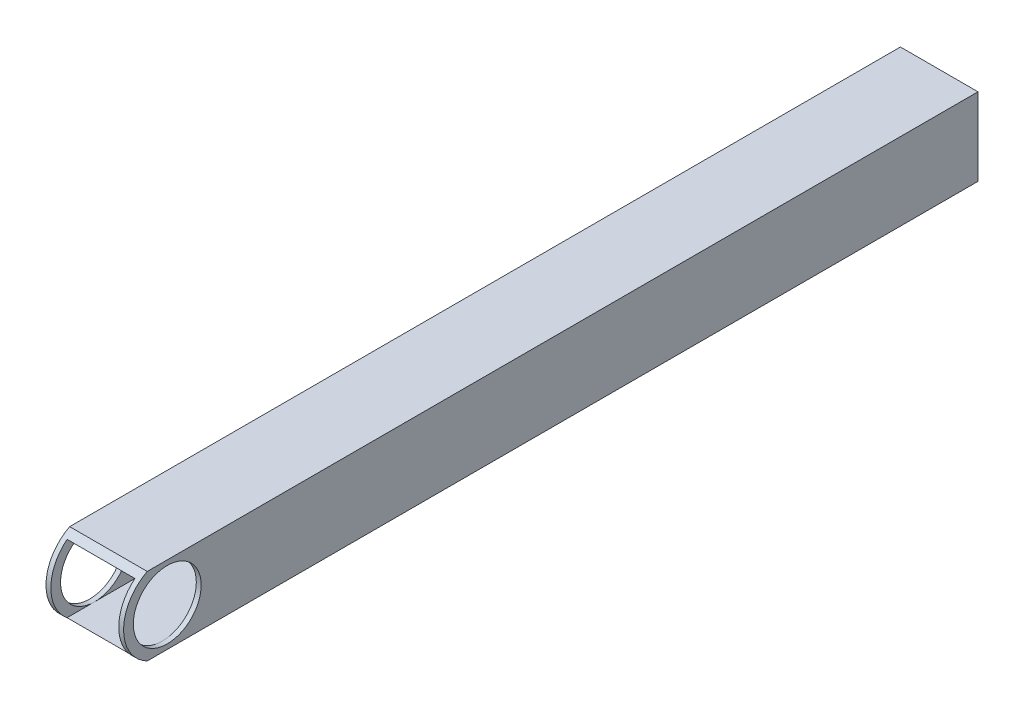
ISO-10303-21;
HEADER;
FILE_DESCRIPTION(('STEP AP214'),'2;1');
FILE_NAME('part.step','',(''),(''),'','','');
FILE_SCHEMA(('AUTOMOTIVE_DESIGN { 1 0 10303 214 1 1 1 1 }'));
ENDSEC;
DATA;
#1=APPLICATION_CONTEXT('core data for automotive mechanical design processes');
#2=APPLICATION_PROTOCOL_DEFINITION('international standard','automotive_design',2000,#1);
#3=PRODUCT_CONTEXT('',#1,'mechanical');
#4=PRODUCT('Part','Part','',(#3));
#5=PRODUCT_RELATED_PRODUCT_CATEGORY('part','',(#4));
#6=PRODUCT_DEFINITION_FORMATION('','',#4);
#7=PRODUCT_DEFINITION_CONTEXT('part definition',#1,'design');
#8=PRODUCT_DEFINITION('design','',#6,#7);
#9=PRODUCT_DEFINITION_SHAPE('','',#8);
#10=(LENGTH_UNIT() NAMED_UNIT(*) SI_UNIT(.MILLI.,.METRE.));
#11=(NAMED_UNIT(*) PLANE_ANGLE_UNIT() SI_UNIT($,.RADIAN.));
#12=(NAMED_UNIT(*) SI_UNIT($,.STERADIAN.) SOLID_ANGLE_UNIT());
#13=UNCERTAINTY_MEASURE_WITH_UNIT(LENGTH_MEASURE(1.E-05),#10,'distance_accuracy_value','');
#14=(GEOMETRIC_REPRESENTATION_CONTEXT(3) GLOBAL_UNCERTAINTY_ASSIGNED_CONTEXT((#13)) GLOBAL_UNIT_ASSIGNED_CONTEXT((#10,
#11,#12)) REPRESENTATION_CONTEXT('',''));
#15=CARTESIAN_POINT('',(0.,0.,0.));
#16=DIRECTION('',(0.,0.,1.));
#17=DIRECTION('',(1.,0.,0.));
#18=AXIS2_PLACEMENT_3D('',#15,#16,#17);
#19=CARTESIAN_POINT('',(-11.1125,-12.7,142.24));
#20=DIRECTION('',(1.,0.,0.));
#21=DIRECTION('',(0.,0.,-1.));
#22=AXIS2_PLACEMENT_3D('',#19,#20,#21);
#23=PLANE('',#22);
#24=CARTESIAN_POINT('',(-11.1125,0.,123.19));
#25=DIRECTION('',(1.,0.,0.));
#26=DIRECTION('',(0.,0.,-1.));
#27=AXIS2_PLACEMENT_3D('',#24,#25,#26);
#28=CIRCLE('',#27,14.2875);
#29=CARTESIAN_POINT('',(-11.1125,-11.1125,132.170256121069));
#30=VERTEX_POINT('',#29);
#31=CARTESIAN_POINT('',(-11.1125,11.1125,132.170256121069));
#32=VERTEX_POINT('',#31);
#33=EDGE_CURVE('E83',#30,#32,#28,.F.);
#34=ORIENTED_EDGE('',*,*,#33,.F.);
#35=DIRECTION('',(0.,0.,-1.));
#36=VECTOR('',#35,1.);
#37=CARTESIAN_POINT('',(-11.1125,-11.1125,142.24));
#38=LINE('',#37,#36);
#39=CARTESIAN_POINT('',(-11.1125,-11.1125,123.19));
#40=VERTEX_POINT('',#39);
#41=EDGE_CURVE('E170',#30,#40,#38,.T.);
#42=ORIENTED_EDGE('',*,*,#41,.T.);
#43=CARTESIAN_POINT('',(-11.1125,0.,123.19));
#44=DIRECTION('',(1.,0.,0.));
#45=DIRECTION('',(0.,0.,-1.));
#46=AXIS2_PLACEMENT_3D('',#43,#44,#45);
#47=CIRCLE('',#46,11.1125);
#48=CARTESIAN_POINT('',(-11.1125,11.1125,123.19));
#49=VERTEX_POINT('',#48);
#50=EDGE_CURVE('E194',#49,#40,#47,.T.);
#51=ORIENTED_EDGE('',*,*,#50,.F.);
#52=DIRECTION('',(0.,0.,-1.));
#53=VECTOR('',#52,1.);
#54=CARTESIAN_POINT('',(-11.1125,11.1125,142.24));
#55=LINE('',#54,#53);
#56=EDGE_CURVE('E179',#32,#49,#55,.T.);
#57=ORIENTED_EDGE('',*,*,#56,.F.);
#58=EDGE_LOOP('',(#34,#42,#51,#57));
#59=FACE_BOUND('',#58,.T.);
#60=ADVANCED_FACE('F61',(#59),#23,.T.);
#61=CARTESIAN_POINT('',(11.1125,-12.7,142.24));
#62=DIRECTION('',(-1.,0.,0.));
#63=DIRECTION('',(0.,0.,1.));
#64=AXIS2_PLACEMENT_3D('',#61,#62,#63);
#65=PLANE('',#64);
#66=CARTESIAN_POINT('',(11.1125,0.,123.19));
#67=DIRECTION('',(-1.,0.,0.));
#68=DIRECTION('',(0.,0.,1.));
#69=AXIS2_PLACEMENT_3D('',#66,#67,#68);
#70=CIRCLE('',#69,11.1125);
#71=CARTESIAN_POINT('',(11.1125,11.1125,123.19));
#72=VERTEX_POINT('',#71);
#73=CARTESIAN_POINT('',(11.1125,-11.1125,123.19));
#74=VERTEX_POINT('',#73);
#75=EDGE_CURVE('E198',#72,#74,#70,.T.);
#76=ORIENTED_EDGE('',*,*,#75,.F.);
#77=DIRECTION('',(0.,0.,-1.));
#78=VECTOR('',#77,1.);
#79=CARTESIAN_POINT('',(11.1125,11.1125,142.24));
#80=LINE('',#79,#78);
#81=CARTESIAN_POINT('',(11.1125,11.1125,-142.24));
#82=VERTEX_POINT('',#81);
#83=EDGE_CURVE('E178',#72,#82,#80,.T.);
#84=ORIENTED_EDGE('',*,*,#83,.T.);
#85=DIRECTION('',(0.,1.,0.));
#86=VECTOR('',#85,1.);
#87=CARTESIAN_POINT('',(11.1125,-12.7,-142.24));
#88=LINE('',#87,#86);
#89=CARTESIAN_POINT('',(11.1125,-11.1125,-142.24));
#90=VERTEX_POINT('',#89);
#91=EDGE_CURVE('E185',#90,#82,#88,.T.);
#92=ORIENTED_EDGE('',*,*,#91,.F.);
#93=DIRECTION('',(0.,0.,-1.));
#94=VECTOR('',#93,1.);
#95=CARTESIAN_POINT('',(11.1125,-11.1125,142.24));
#96=LINE('',#95,#94);
#97=EDGE_CURVE('E175',#74,#90,#96,.T.);
#98=ORIENTED_EDGE('',*,*,#97,.F.);
#99=EDGE_LOOP('',(#76,#84,#92,#98));
#100=FACE_BOUND('',#99,.T.);
#101=ADVANCED_FACE('F230',(#100),#65,.T.);
#102=CARTESIAN_POINT('',(0.,0.,-142.24));
#103=DIRECTION('',(0.,0.,1.));
#104=DIRECTION('',(1.,0.,0.));
#105=AXIS2_PLACEMENT_3D('',#102,#103,#104);
#106=PLANE('',#105);
#107=DIRECTION('',(0.,-1.,0.));
#108=VECTOR('',#107,1.);
#109=CARTESIAN_POINT('',(-12.7,-12.7,-142.24));
#110=LINE('',#109,#108);
#111=CARTESIAN_POINT('',(-12.7,12.7,-142.24));
#112=VERTEX_POINT('',#111);
#113=CARTESIAN_POINT('',(-12.7,-12.7,-142.24));
#114=VERTEX_POINT('',#113);
#115=EDGE_CURVE('E154',#112,#114,#110,.T.);
#116=ORIENTED_EDGE('',*,*,#115,.F.);
#117=DIRECTION('',(-1.,0.,0.));
#118=VECTOR('',#117,1.);
#119=CARTESIAN_POINT('',(12.7,12.7,-142.24));
#120=LINE('',#119,#118);
#121=CARTESIAN_POINT('',(12.7,12.7,-142.24));
#122=VERTEX_POINT('',#121);
#123=EDGE_CURVE('E161',#122,#112,#120,.T.);
#124=ORIENTED_EDGE('',*,*,#123,.F.);
#125=DIRECTION('',(0.,1.,0.));
#126=VECTOR('',#125,1.);
#127=CARTESIAN_POINT('',(12.7,-12.7,-142.24));
#128=LINE('',#127,#126);
#129=CARTESIAN_POINT('',(12.7,-12.7,-142.24));
#130=VERTEX_POINT('',#129);
#131=EDGE_CURVE('E164',#130,#122,#128,.T.);
#132=ORIENTED_EDGE('',*,*,#131,.F.);
#133=DIRECTION('',(1.,0.,0.));
#134=VECTOR('',#133,1.);
#135=CARTESIAN_POINT('',(12.7,-12.7,-142.24));
#136=LINE('',#135,#134);
#137=EDGE_CURVE('E167',#114,#130,#136,.T.);
#138=ORIENTED_EDGE('',*,*,#137,.F.);
#139=EDGE_LOOP('',(#116,#124,#132,#138));
#140=FACE_BOUND('',#139,.T.);
#141=DIRECTION('',(0.,-1.,0.));
#142=VECTOR('',#141,1.);
#143=CARTESIAN_POINT('',(-11.1125,-12.7,-142.24));
#144=LINE('',#143,#142);
#145=CARTESIAN_POINT('',(-11.1125,11.1125,-142.24));
#146=VERTEX_POINT('',#145);
#147=CARTESIAN_POINT('',(-11.1125,-11.1125,-142.24));
#148=VERTEX_POINT('',#147);
#149=EDGE_CURVE('E191',#146,#148,#144,.T.);
#150=ORIENTED_EDGE('',*,*,#149,.T.);
#151=DIRECTION('',(1.,0.,0.));
#152=VECTOR('',#151,1.);
#153=CARTESIAN_POINT('',(12.7,-11.1125,-142.24));
#154=LINE('',#153,#152);
#155=EDGE_CURVE('E188',#148,#90,#154,.T.);
#156=ORIENTED_EDGE('',*,*,#155,.T.);
#157=ORIENTED_EDGE('',*,*,#91,.T.);
#158=DIRECTION('',(-1.,0.,0.));
#159=VECTOR('',#158,1.);
#160=CARTESIAN_POINT('',(12.7,11.1125,-142.24));
#161=LINE('',#160,#159);
#162=EDGE_CURVE('E182',#82,#146,#161,.T.);
#163=ORIENTED_EDGE('',*,*,#162,.T.);
#164=EDGE_LOOP('',(#150,#156,#157,#163));
#165=FACE_BOUND('',#164,.T.);
#166=ADVANCED_FACE('F235',(#140,#165),#106,.F.);
#167=CARTESIAN_POINT('',(-12.7,-12.7,142.24));
#168=DIRECTION('',(1.,0.,0.));
#169=DIRECTION('',(0.,0.,-1.));
#170=AXIS2_PLACEMENT_3D('',#167,#168,#169);
#171=PLANE('',#170);
#172=CARTESIAN_POINT('',(-12.7,0.,123.19));
#173=DIRECTION('',(1.,0.,0.));
#174=DIRECTION('',(0.,0.,-1.));
#175=AXIS2_PLACEMENT_3D('',#172,#173,#174);
#176=CIRCLE('',#175,11.1125);
#177=CARTESIAN_POINT('',(-12.7,0.,112.0775));
#178=VERTEX_POINT('',#177);
#179=EDGE_CURVE('E202',#178,#178,#176,.T.);
#180=ORIENTED_EDGE('',*,*,#179,.T.);
#181=EDGE_LOOP('',(#180));
#182=FACE_BOUND('',#181,.T.);
#183=DIRECTION('',(0.,0.,-1.));
#184=VECTOR('',#183,1.);
#185=CARTESIAN_POINT('',(-12.7,-12.7,142.24));
#186=LINE('',#185,#184);
#187=CARTESIAN_POINT('',(-12.7,-12.7,129.735430180668));
#188=VERTEX_POINT('',#187);
#189=EDGE_CURVE('E69',#188,#114,#186,.T.);
#190=ORIENTED_EDGE('',*,*,#189,.F.);
#191=CARTESIAN_POINT('',(-12.7,0.,123.19));
#192=DIRECTION('',(-1.,0.,0.));
#193=DIRECTION('',(0.,0.,-1.));
#194=AXIS2_PLACEMENT_3D('',#191,#192,#193);
#195=CIRCLE('',#194,14.2875);
#196=CARTESIAN_POINT('',(-12.7,12.7,129.735430180668));
#197=VERTEX_POINT('',#196);
#198=EDGE_CURVE('E135',#188,#197,#195,.T.);
#199=ORIENTED_EDGE('',*,*,#198,.T.);
#200=DIRECTION('',(0.,0.,-1.));
#201=VECTOR('',#200,1.);
#202=CARTESIAN_POINT('',(-12.7,12.7,142.24));
#203=LINE('',#202,#201);
#204=EDGE_CURVE('E159',#197,#112,#203,.T.);
#205=ORIENTED_EDGE('',*,*,#204,.T.);
#206=ORIENTED_EDGE('',*,*,#115,.T.);
#207=EDGE_LOOP('',(#190,#199,#205,#206));
#208=FACE_BOUND('',#207,.T.);
#209=ADVANCED_FACE('F63',(#182,#208),#171,.F.);
#210=CARTESIAN_POINT('',(12.7,-12.7,142.24));
#211=DIRECTION('',(0.,1.,0.));
#212=DIRECTION('',(-1.,0.,0.));
#213=AXIS2_PLACEMENT_3D('',#210,#211,#212);
#214=PLANE('',#213);
#215=DIRECTION('',(0.,0.,-1.));
#216=VECTOR('',#215,1.);
#217=CARTESIAN_POINT('',(12.7,-12.7,142.24));
#218=LINE('',#217,#216);
#219=CARTESIAN_POINT('',(12.7,-12.7,129.735430180668));
#220=VERTEX_POINT('',#219);
#221=EDGE_CURVE('E149',#220,#130,#218,.T.);
#222=ORIENTED_EDGE('',*,*,#221,.F.);
#223=DIRECTION('',(1.,0.,0.));
#224=VECTOR('',#223,1.);
#225=CARTESIAN_POINT('',(-12.7,-12.7,129.735430180668));
#226=LINE('',#225,#224);
#227=EDGE_CURVE('E138',#188,#220,#226,.T.);
#228=ORIENTED_EDGE('',*,*,#227,.F.);
#229=ORIENTED_EDGE('',*,*,#189,.T.);
#230=ORIENTED_EDGE('',*,*,#137,.T.);
#231=EDGE_LOOP('',(#222,#228,#229,#230));
#232=FACE_BOUND('',#231,.T.);
#233=ADVANCED_FACE('F146',(#232),#214,.F.);
#234=CARTESIAN_POINT('',(12.7,-12.7,142.24));
#235=DIRECTION('',(-1.,0.,0.));
#236=DIRECTION('',(0.,0.,1.));
#237=AXIS2_PLACEMENT_3D('',#234,#235,#236);
#238=PLANE('',#237);
#239=CARTESIAN_POINT('',(12.7,0.,123.19));
#240=DIRECTION('',(1.,0.,0.));
#241=DIRECTION('',(0.,0.,-1.));
#242=AXIS2_PLACEMENT_3D('',#239,#240,#241);
#243=CIRCLE('',#242,11.1125);
#244=CARTESIAN_POINT('',(12.7,0.,112.0775));
#245=VERTEX_POINT('',#244);
#246=EDGE_CURVE('E203',#245,#245,#243,.T.);
#247=ORIENTED_EDGE('',*,*,#246,.F.);
#248=EDGE_LOOP('',(#247));
#249=FACE_BOUND('',#248,.T.);
#250=DIRECTION('',(0.,0.,-1.));
#251=VECTOR('',#250,1.);
#252=CARTESIAN_POINT('',(12.7,12.7,142.24));
#253=LINE('',#252,#251);
#254=CARTESIAN_POINT('',(12.7,12.7,129.735430180668));
#255=VERTEX_POINT('',#254);
#256=EDGE_CURVE('E155',#255,#122,#253,.T.);
#257=ORIENTED_EDGE('',*,*,#256,.F.);
#258=CARTESIAN_POINT('',(12.7,0.,123.19));
#259=DIRECTION('',(-1.,0.,0.));
#260=DIRECTION('',(0.,0.,-1.));
#261=AXIS2_PLACEMENT_3D('',#258,#259,#260);
#262=CIRCLE('',#261,14.2875);
#263=EDGE_CURVE('E76',#220,#255,#262,.T.);
#264=ORIENTED_EDGE('',*,*,#263,.F.);
#265=ORIENTED_EDGE('',*,*,#221,.T.);
#266=ORIENTED_EDGE('',*,*,#131,.T.);
#267=EDGE_LOOP('',(#257,#264,#265,#266));
#268=FACE_BOUND('',#267,.T.);
#269=ADVANCED_FACE('F272',(#249,#268),#238,.F.);
#270=CARTESIAN_POINT('',(12.7,12.7,142.24));
#271=DIRECTION('',(0.,-1.,0.));
#272=DIRECTION('',(1.,0.,0.));
#273=AXIS2_PLACEMENT_3D('',#270,#271,#272);
#274=PLANE('',#273);
#275=ORIENTED_EDGE('',*,*,#204,.F.);
#276=DIRECTION('',(1.,0.,0.));
#277=VECTOR('',#276,1.);
#278=CARTESIAN_POINT('',(-12.7,12.7,129.735430180668));
#279=LINE('',#278,#277);
#280=EDGE_CURVE('E139',#197,#255,#279,.T.);
#281=ORIENTED_EDGE('',*,*,#280,.T.);
#282=ORIENTED_EDGE('',*,*,#256,.T.);
#283=ORIENTED_EDGE('',*,*,#123,.T.);
#284=EDGE_LOOP('',(#275,#281,#282,#283));
#285=FACE_BOUND('',#284,.T.);
#286=ADVANCED_FACE('F267',(#285),#274,.F.);
#287=EDGE_CURVE('E195',#40,#49,#47,.T.);
#288=ORIENTED_EDGE('',*,*,#287,.F.);
#289=EDGE_CURVE('E172',#40,#148,#38,.T.);
#290=ORIENTED_EDGE('',*,*,#289,.T.);
#291=ORIENTED_EDGE('',*,*,#149,.F.);
#292=EDGE_CURVE('E181',#49,#146,#55,.T.);
#293=ORIENTED_EDGE('',*,*,#292,.F.);
#294=EDGE_LOOP('',(#288,#290,#291,#293));
#295=FACE_BOUND('',#294,.T.);
#296=ADVANCED_FACE('F240',(#295),#23,.T.);
#297=CARTESIAN_POINT('',(12.7,-11.1125,142.24));
#298=DIRECTION('',(0.,1.,0.));
#299=DIRECTION('',(-1.,0.,0.));
#300=AXIS2_PLACEMENT_3D('',#297,#298,#299);
#301=PLANE('',#300);
#302=DIRECTION('',(1.,0.,0.));
#303=VECTOR('',#302,1.);
#304=CARTESIAN_POINT('',(-12.7,-11.1125,132.170256121069));
#305=LINE('',#304,#303);
#306=CARTESIAN_POINT('',(11.1125,-11.1125,132.170256121069));
#307=VERTEX_POINT('',#306);
#308=EDGE_CURVE('E210',#307,#30,#305,.F.);
#309=ORIENTED_EDGE('',*,*,#308,.F.);
#310=EDGE_CURVE('E173',#307,#74,#96,.T.);
#311=ORIENTED_EDGE('',*,*,#310,.T.);
#312=ORIENTED_EDGE('',*,*,#97,.T.);
#313=ORIENTED_EDGE('',*,*,#155,.F.);
#314=ORIENTED_EDGE('',*,*,#289,.F.);
#315=ORIENTED_EDGE('',*,*,#41,.F.);
#316=EDGE_LOOP('',(#309,#311,#312,#313,#314,#315));
#317=FACE_BOUND('',#316,.T.);
#318=ADVANCED_FACE('F220',(#317),#301,.T.);
#319=CARTESIAN_POINT('',(11.1125,0.,123.19));
#320=DIRECTION('',(-1.,0.,0.));
#321=DIRECTION('',(0.,0.,1.));
#322=AXIS2_PLACEMENT_3D('',#319,#320,#321);
#323=CIRCLE('',#322,14.2875);
#324=CARTESIAN_POINT('',(11.1125,11.1125,132.170256121069));
#325=VERTEX_POINT('',#324);
#326=EDGE_CURVE('E150',#325,#307,#323,.F.);
#327=ORIENTED_EDGE('',*,*,#326,.F.);
#328=EDGE_CURVE('E176',#325,#72,#80,.T.);
#329=ORIENTED_EDGE('',*,*,#328,.T.);
#330=EDGE_CURVE('E199',#74,#72,#70,.T.);
#331=ORIENTED_EDGE('',*,*,#330,.F.);
#332=ORIENTED_EDGE('',*,*,#310,.F.);
#333=EDGE_LOOP('',(#327,#329,#331,#332));
#334=FACE_BOUND('',#333,.T.);
#335=ADVANCED_FACE('F224',(#334),#65,.T.);
#336=CARTESIAN_POINT('',(12.7,11.1125,142.24));
#337=DIRECTION('',(0.,-1.,0.));
#338=DIRECTION('',(1.,0.,0.));
#339=AXIS2_PLACEMENT_3D('',#336,#337,#338);
#340=PLANE('',#339);
#341=DIRECTION('',(1.,0.,0.));
#342=VECTOR('',#341,1.);
#343=CARTESIAN_POINT('',(-12.7,11.1125,132.170256121069));
#344=LINE('',#343,#342);
#345=EDGE_CURVE('E12',#32,#325,#344,.T.);
#346=ORIENTED_EDGE('',*,*,#345,.F.);
#347=ORIENTED_EDGE('',*,*,#56,.T.);
#348=ORIENTED_EDGE('',*,*,#292,.T.);
#349=ORIENTED_EDGE('',*,*,#162,.F.);
#350=ORIENTED_EDGE('',*,*,#83,.F.);
#351=ORIENTED_EDGE('',*,*,#328,.F.);
#352=EDGE_LOOP('',(#346,#347,#348,#349,#350,#351));
#353=FACE_BOUND('',#352,.T.);
#354=ADVANCED_FACE('F249',(#353),#340,.T.);
#355=CARTESIAN_POINT('',(-12.7,0.,123.19));
#356=DIRECTION('',(1.,0.,0.));
#357=DIRECTION('',(0.,0.,-1.));
#358=AXIS2_PLACEMENT_3D('',#355,#356,#357);
#359=CYLINDRICAL_SURFACE('',#358,11.1125);
#360=ORIENTED_EDGE('',*,*,#75,.T.);
#361=ORIENTED_EDGE('',*,*,#330,.T.);
#362=EDGE_LOOP('',(#360,#361));
#363=FACE_BOUND('',#362,.T.);
#364=ORIENTED_EDGE('',*,*,#246,.T.);
#365=EDGE_LOOP('',(#364));
#366=FACE_BOUND('',#365,.T.);
#367=ADVANCED_FACE('F251',(#363,#366),#359,.F.);
#368=ORIENTED_EDGE('',*,*,#50,.T.);
#369=ORIENTED_EDGE('',*,*,#287,.T.);
#370=EDGE_LOOP('',(#368,#369));
#371=FACE_BOUND('',#370,.T.);
#372=ORIENTED_EDGE('',*,*,#179,.F.);
#373=EDGE_LOOP('',(#372));
#374=FACE_BOUND('',#373,.T.);
#375=ADVANCED_FACE('F244',(#371,#374),#359,.F.);
#376=CARTESIAN_POINT('',(-12.7,0.,123.19));
#377=DIRECTION('',(1.,0.,0.));
#378=DIRECTION('',(0.,0.,-1.));
#379=AXIS2_PLACEMENT_3D('',#376,#377,#378);
#380=CYLINDRICAL_SURFACE('',#379,14.2875);
#381=ORIENTED_EDGE('',*,*,#33,.T.);
#382=ORIENTED_EDGE('',*,*,#345,.T.);
#383=ORIENTED_EDGE('',*,*,#326,.T.);
#384=ORIENTED_EDGE('',*,*,#308,.T.);
#385=EDGE_LOOP('',(#381,#382,#383,#384));
#386=FACE_BOUND('',#385,.T.);
#387=ORIENTED_EDGE('',*,*,#198,.F.);
#388=ORIENTED_EDGE('',*,*,#227,.T.);
#389=ORIENTED_EDGE('',*,*,#263,.T.);
#390=ORIENTED_EDGE('',*,*,#280,.F.);
#391=EDGE_LOOP('',(#387,#388,#389,#390));
#392=FACE_BOUND('',#391,.T.);
#393=ADVANCED_FACE('F137',(#386,#392),#380,.T.);
#394=CLOSED_SHELL('',(#60,#101,#166,#209,#233,#269,#286,#296,#318,#335,#354,#367,#375,#393));
#395=MANIFOLD_SOLID_BREP('B2',#394);
#396=ADVANCED_BREP_SHAPE_REPRESENTATION('',(#18,#395),#14);
#397=SHAPE_DEFINITION_REPRESENTATION(#9,#396);
ENDSEC;
END-ISO-10303-21;
